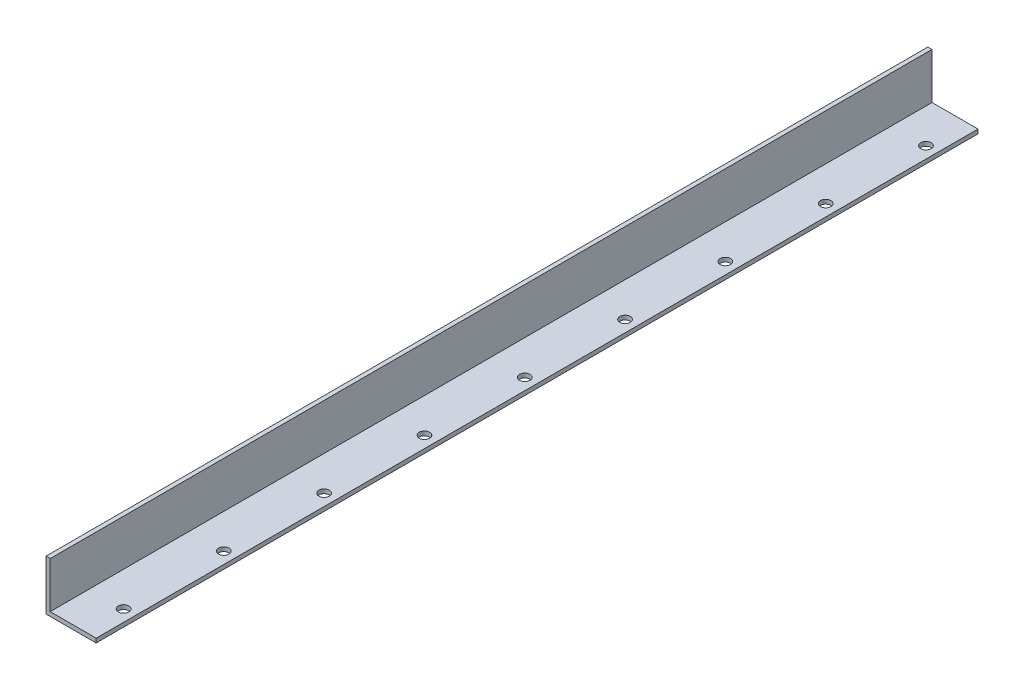
ISO-10303-21;
HEADER;
FILE_DESCRIPTION(('STEP AP214'),'2;1');
FILE_NAME('part.step','',(''),(''),'','','');
FILE_SCHEMA(('AUTOMOTIVE_DESIGN { 1 0 10303 214 1 1 1 1 }'));
ENDSEC;
DATA;
#1=APPLICATION_CONTEXT('core data for automotive mechanical design processes');
#2=APPLICATION_PROTOCOL_DEFINITION('international standard','automotive_design',2000,#1);
#3=PRODUCT_CONTEXT('',#1,'mechanical');
#4=PRODUCT('Part','Part','',(#3));
#5=PRODUCT_RELATED_PRODUCT_CATEGORY('part','',(#4));
#6=PRODUCT_DEFINITION_FORMATION('','',#4);
#7=PRODUCT_DEFINITION_CONTEXT('part definition',#1,'design');
#8=PRODUCT_DEFINITION('design','',#6,#7);
#9=PRODUCT_DEFINITION_SHAPE('','',#8);
#10=(LENGTH_UNIT() NAMED_UNIT(*) SI_UNIT(.MILLI.,.METRE.));
#11=(NAMED_UNIT(*) PLANE_ANGLE_UNIT() SI_UNIT($,.RADIAN.));
#12=(NAMED_UNIT(*) SI_UNIT($,.STERADIAN.) SOLID_ANGLE_UNIT());
#13=UNCERTAINTY_MEASURE_WITH_UNIT(LENGTH_MEASURE(1.E-05),#10,'distance_accuracy_value','');
#14=(GEOMETRIC_REPRESENTATION_CONTEXT(3) GLOBAL_UNCERTAINTY_ASSIGNED_CONTEXT((#13)) GLOBAL_UNIT_ASSIGNED_CONTEXT((#10,
#11,#12)) REPRESENTATION_CONTEXT('',''));
#15=CARTESIAN_POINT('',(0.,0.,0.));
#16=DIRECTION('',(0.,0.,1.));
#17=DIRECTION('',(1.,0.,0.));
#18=AXIS2_PLACEMENT_3D('',#15,#16,#17);
#19=CARTESIAN_POINT('',(29.291724556134,0.,-304.23716687116));
#20=DIRECTION('',(0.,-1.,0.));
#21=DIRECTION('',(0.,0.,-1.));
#22=AXIS2_PLACEMENT_3D('',#19,#20,#21);
#23=CYLINDRICAL_SURFACE('',#22,3.96875);
#24=CARTESIAN_POINT('',(29.291724556134,3.175,-304.23716687116));
#25=DIRECTION('',(0.,-1.,0.));
#26=DIRECTION('',(0.,0.,-1.));
#27=AXIS2_PLACEMENT_3D('',#24,#25,#26);
#28=CIRCLE('',#27,3.96875);
#29=CARTESIAN_POINT('',(29.291724556134,3.175,-308.20591687116));
#30=VERTEX_POINT('',#29);
#31=EDGE_CURVE('E19',#30,#30,#28,.T.);
#32=ORIENTED_EDGE('',*,*,#31,.F.);
#33=EDGE_LOOP('',(#32));
#34=FACE_BOUND('',#33,.T.);
#35=CARTESIAN_POINT('',(29.291724556134,0.,-304.23716687116));
#36=DIRECTION('',(0.,-1.,0.));
#37=DIRECTION('',(0.,0.,-1.));
#38=AXIS2_PLACEMENT_3D('',#35,#36,#37);
#39=CIRCLE('',#38,3.96875);
#40=CARTESIAN_POINT('',(29.291724556134,0.,-308.20591687116));
#41=VERTEX_POINT('',#40);
#42=EDGE_CURVE('E122',#41,#41,#39,.F.);
#43=ORIENTED_EDGE('',*,*,#42,.F.);
#44=EDGE_LOOP('',(#43));
#45=FACE_BOUND('',#44,.T.);
#46=ADVANCED_FACE('F16',(#34,#45),#23,.F.);
#47=CARTESIAN_POINT('',(29.291724556134,0.,-228.037166871033));
#48=DIRECTION('',(0.,-1.,0.));
#49=DIRECTION('',(0.,0.,-1.));
#50=AXIS2_PLACEMENT_3D('',#47,#48,#49);
#51=CYLINDRICAL_SURFACE('',#50,3.96875);
#52=CARTESIAN_POINT('',(29.291724556134,3.175,-228.037166871033));
#53=DIRECTION('',(0.,-1.,0.));
#54=DIRECTION('',(0.,0.,-1.));
#55=AXIS2_PLACEMENT_3D('',#52,#53,#54);
#56=CIRCLE('',#55,3.96875);
#57=CARTESIAN_POINT('',(29.291724556134,3.175,-232.005916871033));
#58=VERTEX_POINT('',#57);
#59=EDGE_CURVE('E144',#58,#58,#56,.T.);
#60=ORIENTED_EDGE('',*,*,#59,.F.);
#61=EDGE_LOOP('',(#60));
#62=FACE_BOUND('',#61,.T.);
#63=CARTESIAN_POINT('',(29.291724556134,0.,-228.037166871033));
#64=DIRECTION('',(0.,-1.,0.));
#65=DIRECTION('',(0.,0.,-1.));
#66=AXIS2_PLACEMENT_3D('',#63,#64,#65);
#67=CIRCLE('',#66,3.96875);
#68=CARTESIAN_POINT('',(29.291724556134,0.,-232.005916871033));
#69=VERTEX_POINT('',#68);
#70=EDGE_CURVE('E119',#69,#69,#67,.F.);
#71=ORIENTED_EDGE('',*,*,#70,.F.);
#72=EDGE_LOOP('',(#71));
#73=FACE_BOUND('',#72,.T.);
#74=ADVANCED_FACE('F154',(#62,#73),#51,.F.);
#75=CARTESIAN_POINT('',(29.291724556134,0.,-151.837166871033));
#76=DIRECTION('',(0.,-1.,0.));
#77=DIRECTION('',(0.,0.,-1.));
#78=AXIS2_PLACEMENT_3D('',#75,#76,#77);
#79=CYLINDRICAL_SURFACE('',#78,3.96875);
#80=CARTESIAN_POINT('',(29.291724556134,3.175,-151.837166871033));
#81=DIRECTION('',(0.,-1.,0.));
#82=DIRECTION('',(0.,0.,-1.));
#83=AXIS2_PLACEMENT_3D('',#80,#81,#82);
#84=CIRCLE('',#83,3.96875);
#85=CARTESIAN_POINT('',(29.291724556134,3.175,-155.805916871033));
#86=VERTEX_POINT('',#85);
#87=EDGE_CURVE('E142',#86,#86,#84,.T.);
#88=ORIENTED_EDGE('',*,*,#87,.F.);
#89=EDGE_LOOP('',(#88));
#90=FACE_BOUND('',#89,.T.);
#91=CARTESIAN_POINT('',(29.291724556134,0.,-151.837166871033));
#92=DIRECTION('',(0.,-1.,0.));
#93=DIRECTION('',(0.,0.,-1.));
#94=AXIS2_PLACEMENT_3D('',#91,#92,#93);
#95=CIRCLE('',#94,3.96875);
#96=CARTESIAN_POINT('',(29.291724556134,0.,-155.805916871033));
#97=VERTEX_POINT('',#96);
#98=EDGE_CURVE('E116',#97,#97,#95,.F.);
#99=ORIENTED_EDGE('',*,*,#98,.F.);
#100=EDGE_LOOP('',(#99));
#101=FACE_BOUND('',#100,.T.);
#102=ADVANCED_FACE('F315',(#90,#101),#79,.F.);
#103=CARTESIAN_POINT('',(29.291724556134,0.,-75.637166871033));
#104=DIRECTION('',(0.,-1.,0.));
#105=DIRECTION('',(0.,0.,-1.));
#106=AXIS2_PLACEMENT_3D('',#103,#104,#105);
#107=CYLINDRICAL_SURFACE('',#106,3.96875);
#108=CARTESIAN_POINT('',(29.291724556134,3.175,-75.637166871033));
#109=DIRECTION('',(0.,-1.,0.));
#110=DIRECTION('',(0.,0.,-1.));
#111=AXIS2_PLACEMENT_3D('',#108,#109,#110);
#112=CIRCLE('',#111,3.96875);
#113=CARTESIAN_POINT('',(29.291724556134,3.175,-79.605916871033));
#114=VERTEX_POINT('',#113);
#115=EDGE_CURVE('E139',#114,#114,#112,.T.);
#116=ORIENTED_EDGE('',*,*,#115,.F.);
#117=EDGE_LOOP('',(#116));
#118=FACE_BOUND('',#117,.T.);
#119=CARTESIAN_POINT('',(29.291724556134,0.,-75.637166871033));
#120=DIRECTION('',(0.,-1.,0.));
#121=DIRECTION('',(0.,0.,-1.));
#122=AXIS2_PLACEMENT_3D('',#119,#120,#121);
#123=CIRCLE('',#122,3.96875);
#124=CARTESIAN_POINT('',(29.291724556134,0.,-79.605916871033));
#125=VERTEX_POINT('',#124);
#126=EDGE_CURVE('E113',#125,#125,#123,.F.);
#127=ORIENTED_EDGE('',*,*,#126,.F.);
#128=EDGE_LOOP('',(#127));
#129=FACE_BOUND('',#128,.T.);
#130=ADVANCED_FACE('F306',(#118,#129),#107,.F.);
#131=CARTESIAN_POINT('',(29.291724556134,0.,0.562833128959634));
#132=DIRECTION('',(0.,-1.,0.));
#133=DIRECTION('',(0.,0.,-1.));
#134=AXIS2_PLACEMENT_3D('',#131,#132,#133);
#135=CYLINDRICAL_SURFACE('',#134,3.96875);
#136=CARTESIAN_POINT('',(29.291724556134,3.175,0.562833128959634));
#137=DIRECTION('',(0.,-1.,0.));
#138=DIRECTION('',(0.,0.,-1.));
#139=AXIS2_PLACEMENT_3D('',#136,#137,#138);
#140=CIRCLE('',#139,3.96875);
#141=CARTESIAN_POINT('',(29.291724556134,3.175,-3.40591687104037));
#142=VERTEX_POINT('',#141);
#143=EDGE_CURVE('E136',#142,#142,#140,.T.);
#144=ORIENTED_EDGE('',*,*,#143,.F.);
#145=EDGE_LOOP('',(#144));
#146=FACE_BOUND('',#145,.T.);
#147=CARTESIAN_POINT('',(29.291724556134,0.,0.562833128959634));
#148=DIRECTION('',(0.,-1.,0.));
#149=DIRECTION('',(0.,0.,-1.));
#150=AXIS2_PLACEMENT_3D('',#147,#148,#149);
#151=CIRCLE('',#150,3.96875);
#152=CARTESIAN_POINT('',(29.291724556134,0.,-3.40591687104037));
#153=VERTEX_POINT('',#152);
#154=EDGE_CURVE('E110',#153,#153,#151,.F.);
#155=ORIENTED_EDGE('',*,*,#154,.F.);
#156=EDGE_LOOP('',(#155));
#157=FACE_BOUND('',#156,.T.);
#158=ADVANCED_FACE('F297',(#146,#157),#135,.F.);
#159=CARTESIAN_POINT('',(29.291724556134,0.,76.762833128967));
#160=DIRECTION('',(0.,-1.,0.));
#161=DIRECTION('',(0.,0.,-1.));
#162=AXIS2_PLACEMENT_3D('',#159,#160,#161);
#163=CYLINDRICAL_SURFACE('',#162,3.96875);
#164=CARTESIAN_POINT('',(29.291724556134,3.175,76.762833128967));
#165=DIRECTION('',(0.,-1.,0.));
#166=DIRECTION('',(0.,0.,-1.));
#167=AXIS2_PLACEMENT_3D('',#164,#165,#166);
#168=CIRCLE('',#167,3.96875);
#169=CARTESIAN_POINT('',(29.291724556134,3.175,72.794083128967));
#170=VERTEX_POINT('',#169);
#171=EDGE_CURVE('E133',#170,#170,#168,.T.);
#172=ORIENTED_EDGE('',*,*,#171,.F.);
#173=EDGE_LOOP('',(#172));
#174=FACE_BOUND('',#173,.T.);
#175=CARTESIAN_POINT('',(29.291724556134,0.,76.762833128967));
#176=DIRECTION('',(0.,-1.,0.));
#177=DIRECTION('',(0.,0.,-1.));
#178=AXIS2_PLACEMENT_3D('',#175,#176,#177);
#179=CIRCLE('',#178,3.96875);
#180=CARTESIAN_POINT('',(29.291724556134,0.,72.794083128967));
#181=VERTEX_POINT('',#180);
#182=EDGE_CURVE('E107',#181,#181,#179,.F.);
#183=ORIENTED_EDGE('',*,*,#182,.F.);
#184=EDGE_LOOP('',(#183));
#185=FACE_BOUND('',#184,.T.);
#186=ADVANCED_FACE('F288',(#174,#185),#163,.F.);
#187=CARTESIAN_POINT('',(29.291724556134,0.,152.962833128967));
#188=DIRECTION('',(0.,-1.,0.));
#189=DIRECTION('',(0.,0.,-1.));
#190=AXIS2_PLACEMENT_3D('',#187,#188,#189);
#191=CYLINDRICAL_SURFACE('',#190,3.96875);
#192=CARTESIAN_POINT('',(29.291724556134,3.175,152.962833128967));
#193=DIRECTION('',(0.,-1.,0.));
#194=DIRECTION('',(0.,0.,-1.));
#195=AXIS2_PLACEMENT_3D('',#192,#193,#194);
#196=CIRCLE('',#195,3.96875);
#197=CARTESIAN_POINT('',(29.291724556134,3.175,148.994083128967));
#198=VERTEX_POINT('',#197);
#199=EDGE_CURVE('E130',#198,#198,#196,.T.);
#200=ORIENTED_EDGE('',*,*,#199,.F.);
#201=EDGE_LOOP('',(#200));
#202=FACE_BOUND('',#201,.T.);
#203=CARTESIAN_POINT('',(29.291724556134,0.,152.962833128967));
#204=DIRECTION('',(0.,-1.,0.));
#205=DIRECTION('',(0.,0.,-1.));
#206=AXIS2_PLACEMENT_3D('',#203,#204,#205);
#207=CIRCLE('',#206,3.96875);
#208=CARTESIAN_POINT('',(29.291724556134,0.,148.994083128967));
#209=VERTEX_POINT('',#208);
#210=EDGE_CURVE('E104',#209,#209,#207,.F.);
#211=ORIENTED_EDGE('',*,*,#210,.F.);
#212=EDGE_LOOP('',(#211));
#213=FACE_BOUND('',#212,.T.);
#214=ADVANCED_FACE('F279',(#202,#213),#191,.F.);
#215=CARTESIAN_POINT('',(29.291724556134,0.,229.162833128967));
#216=DIRECTION('',(0.,-1.,0.));
#217=DIRECTION('',(0.,0.,-1.));
#218=AXIS2_PLACEMENT_3D('',#215,#216,#217);
#219=CYLINDRICAL_SURFACE('',#218,3.96875);
#220=CARTESIAN_POINT('',(29.291724556134,3.175,229.162833128967));
#221=DIRECTION('',(0.,-1.,0.));
#222=DIRECTION('',(0.,0.,-1.));
#223=AXIS2_PLACEMENT_3D('',#220,#221,#222);
#224=CIRCLE('',#223,3.96875);
#225=CARTESIAN_POINT('',(29.291724556134,3.175,225.194083128967));
#226=VERTEX_POINT('',#225);
#227=EDGE_CURVE('E127',#226,#226,#224,.T.);
#228=ORIENTED_EDGE('',*,*,#227,.F.);
#229=EDGE_LOOP('',(#228));
#230=FACE_BOUND('',#229,.T.);
#231=CARTESIAN_POINT('',(29.291724556134,0.,229.162833128967));
#232=DIRECTION('',(0.,-1.,0.));
#233=DIRECTION('',(0.,0.,-1.));
#234=AXIS2_PLACEMENT_3D('',#231,#232,#233);
#235=CIRCLE('',#234,3.96875);
#236=CARTESIAN_POINT('',(29.291724556134,0.,225.194083128967));
#237=VERTEX_POINT('',#236);
#238=EDGE_CURVE('E101',#237,#237,#235,.F.);
#239=ORIENTED_EDGE('',*,*,#238,.F.);
#240=EDGE_LOOP('',(#239));
#241=FACE_BOUND('',#240,.T.);
#242=ADVANCED_FACE('F270',(#230,#241),#219,.F.);
#243=CARTESIAN_POINT('',(29.291724556134,0.,305.36283312884));
#244=DIRECTION('',(0.,-1.,0.));
#245=DIRECTION('',(0.,0.,-1.));
#246=AXIS2_PLACEMENT_3D('',#243,#244,#245);
#247=CYLINDRICAL_SURFACE('',#246,3.96875);
#248=CARTESIAN_POINT('',(29.291724556134,3.175,305.36283312884));
#249=DIRECTION('',(0.,-1.,0.));
#250=DIRECTION('',(0.,0.,-1.));
#251=AXIS2_PLACEMENT_3D('',#248,#249,#250);
#252=CIRCLE('',#251,3.96875);
#253=CARTESIAN_POINT('',(29.291724556134,3.175,301.39408312884));
#254=VERTEX_POINT('',#253);
#255=EDGE_CURVE('E95',#254,#254,#252,.T.);
#256=ORIENTED_EDGE('',*,*,#255,.F.);
#257=EDGE_LOOP('',(#256));
#258=FACE_BOUND('',#257,.T.);
#259=CARTESIAN_POINT('',(29.291724556134,0.,305.36283312884));
#260=DIRECTION('',(0.,-1.,0.));
#261=DIRECTION('',(0.,0.,-1.));
#262=AXIS2_PLACEMENT_3D('',#259,#260,#261);
#263=CIRCLE('',#262,3.96875);
#264=CARTESIAN_POINT('',(29.291724556134,0.,301.39408312884));
#265=VERTEX_POINT('',#264);
#266=EDGE_CURVE('E97',#265,#265,#263,.F.);
#267=ORIENTED_EDGE('',*,*,#266,.F.);
#268=EDGE_LOOP('',(#267));
#269=FACE_BOUND('',#268,.T.);
#270=ADVANCED_FACE('F262',(#258,#269),#247,.F.);
#271=CARTESIAN_POINT('',(38.1,0.,-334.9625));
#272=DIRECTION('',(1.,0.,0.));
#273=DIRECTION('',(0.,0.,-1.));
#274=AXIS2_PLACEMENT_3D('',#271,#272,#273);
#275=PLANE('',#274);
#276=DIRECTION('',(0.,1.,0.));
#277=VECTOR('',#276,1.);
#278=CARTESIAN_POINT('',(38.1,0.,334.9625));
#279=LINE('',#278,#277);
#280=CARTESIAN_POINT('',(38.1,0.,334.9625));
#281=VERTEX_POINT('',#280);
#282=CARTESIAN_POINT('',(38.1,3.175,334.9625));
#283=VERTEX_POINT('',#282);
#284=EDGE_CURVE('E168',#281,#283,#279,.T.);
#285=ORIENTED_EDGE('',*,*,#284,.F.);
#286=DIRECTION('',(0.,0.,-1.));
#287=VECTOR('',#286,1.);
#288=CARTESIAN_POINT('',(38.1,0.,-334.9625));
#289=LINE('',#288,#287);
#290=CARTESIAN_POINT('',(38.1,0.,-334.9625));
#291=VERTEX_POINT('',#290);
#292=EDGE_CURVE('E76',#291,#281,#289,.F.);
#293=ORIENTED_EDGE('',*,*,#292,.F.);
#294=DIRECTION('',(0.,1.,0.));
#295=VECTOR('',#294,1.);
#296=CARTESIAN_POINT('',(38.1,0.,-334.9625));
#297=LINE('',#296,#295);
#298=CARTESIAN_POINT('',(38.1,3.175,-334.9625));
#299=VERTEX_POINT('',#298);
#300=EDGE_CURVE('E71',#291,#299,#297,.T.);
#301=ORIENTED_EDGE('',*,*,#300,.T.);
#302=DIRECTION('',(0.,0.,1.));
#303=VECTOR('',#302,1.);
#304=CARTESIAN_POINT('',(38.1,3.175,-334.9625));
#305=LINE('',#304,#303);
#306=EDGE_CURVE('E74',#283,#299,#305,.F.);
#307=ORIENTED_EDGE('',*,*,#306,.F.);
#308=EDGE_LOOP('',(#285,#293,#301,#307));
#309=FACE_BOUND('',#308,.T.);
#310=ADVANCED_FACE('F73',(#309),#275,.T.);
#311=CARTESIAN_POINT('',(38.1,3.175,-334.9625));
#312=DIRECTION('',(0.,1.,0.));
#313=DIRECTION('',(0.,0.,1.));
#314=AXIS2_PLACEMENT_3D('',#311,#312,#313);
#315=PLANE('',#314);
#316=ORIENTED_EDGE('',*,*,#255,.T.);
#317=EDGE_LOOP('',(#316));
#318=FACE_BOUND('',#317,.T.);
#319=ORIENTED_EDGE('',*,*,#227,.T.);
#320=EDGE_LOOP('',(#319));
#321=FACE_BOUND('',#320,.T.);
#322=ORIENTED_EDGE('',*,*,#199,.T.);
#323=EDGE_LOOP('',(#322));
#324=FACE_BOUND('',#323,.T.);
#325=ORIENTED_EDGE('',*,*,#171,.T.);
#326=EDGE_LOOP('',(#325));
#327=FACE_BOUND('',#326,.T.);
#328=ORIENTED_EDGE('',*,*,#143,.T.);
#329=EDGE_LOOP('',(#328));
#330=FACE_BOUND('',#329,.T.);
#331=ORIENTED_EDGE('',*,*,#115,.T.);
#332=EDGE_LOOP('',(#331));
#333=FACE_BOUND('',#332,.T.);
#334=ORIENTED_EDGE('',*,*,#87,.T.);
#335=EDGE_LOOP('',(#334));
#336=FACE_BOUND('',#335,.T.);
#337=ORIENTED_EDGE('',*,*,#59,.T.);
#338=EDGE_LOOP('',(#337));
#339=FACE_BOUND('',#338,.T.);
#340=ORIENTED_EDGE('',*,*,#31,.T.);
#341=EDGE_LOOP('',(#340));
#342=FACE_BOUND('',#341,.T.);
#343=DIRECTION('',(1.,0.,0.));
#344=VECTOR('',#343,1.);
#345=CARTESIAN_POINT('',(0.,3.175,334.9625));
#346=LINE('',#345,#344);
#347=CARTESIAN_POINT('',(3.175,3.175,334.9625));
#348=VERTEX_POINT('',#347);
#349=EDGE_CURVE('E83',#283,#348,#346,.F.);
#350=ORIENTED_EDGE('',*,*,#349,.F.);
#351=ORIENTED_EDGE('',*,*,#306,.T.);
#352=DIRECTION('',(1.,0.,0.));
#353=VECTOR('',#352,1.);
#354=CARTESIAN_POINT('',(0.,3.175,-334.9625));
#355=LINE('',#354,#353);
#356=CARTESIAN_POINT('',(3.175,3.175,-334.9625));
#357=VERTEX_POINT('',#356);
#358=EDGE_CURVE('E66',#299,#357,#355,.F.);
#359=ORIENTED_EDGE('',*,*,#358,.T.);
#360=DIRECTION('',(0.,0.,-1.));
#361=VECTOR('',#360,1.);
#362=CARTESIAN_POINT('',(3.175,3.175,-334.9625));
#363=LINE('',#362,#361);
#364=EDGE_CURVE('E79',#348,#357,#363,.T.);
#365=ORIENTED_EDGE('',*,*,#364,.F.);
#366=EDGE_LOOP('',(#350,#351,#359,#365));
#367=FACE_BOUND('',#366,.T.);
#368=ADVANCED_FACE('F81',(#318,#321,#324,#327,#330,#333,#336,#339,#342,#367),#315,.T.);
#369=CARTESIAN_POINT('',(3.175,3.175,-334.9625));
#370=DIRECTION('',(1.,0.,0.));
#371=DIRECTION('',(0.,0.,-1.));
#372=AXIS2_PLACEMENT_3D('',#369,#370,#371);
#373=PLANE('',#372);
#374=DIRECTION('',(0.,1.,0.));
#375=VECTOR('',#374,1.);
#376=CARTESIAN_POINT('',(3.175,0.,334.9625));
#377=LINE('',#376,#375);
#378=CARTESIAN_POINT('',(3.175,38.1,334.9625));
#379=VERTEX_POINT('',#378);
#380=EDGE_CURVE('E185',#348,#379,#377,.T.);
#381=ORIENTED_EDGE('',*,*,#380,.F.);
#382=ORIENTED_EDGE('',*,*,#364,.T.);
#383=DIRECTION('',(0.,1.,0.));
#384=VECTOR('',#383,1.);
#385=CARTESIAN_POINT('',(3.175,0.,-334.9625));
#386=LINE('',#385,#384);
#387=CARTESIAN_POINT('',(3.175,38.1,-334.9625));
#388=VERTEX_POINT('',#387);
#389=EDGE_CURVE('E89',#357,#388,#386,.T.);
#390=ORIENTED_EDGE('',*,*,#389,.T.);
#391=DIRECTION('',(0.,0.,1.));
#392=VECTOR('',#391,1.);
#393=CARTESIAN_POINT('',(3.175,38.1,-334.9625));
#394=LINE('',#393,#392);
#395=EDGE_CURVE('E176',#379,#388,#394,.F.);
#396=ORIENTED_EDGE('',*,*,#395,.F.);
#397=EDGE_LOOP('',(#381,#382,#390,#396));
#398=FACE_BOUND('',#397,.T.);
#399=ADVANCED_FACE('F194',(#398),#373,.T.);
#400=CARTESIAN_POINT('',(0.,0.,-334.9625));
#401=DIRECTION('',(0.,0.,1.));
#402=DIRECTION('',(1.,0.,0.));
#403=AXIS2_PLACEMENT_3D('',#400,#401,#402);
#404=PLANE('',#403);
#405=DIRECTION('',(0.,1.,0.));
#406=VECTOR('',#405,1.);
#407=CARTESIAN_POINT('',(0.,38.1,-334.9625));
#408=LINE('',#407,#406);
#409=CARTESIAN_POINT('',(0.,38.1,-334.9625));
#410=VERTEX_POINT('',#409);
#411=CARTESIAN_POINT('',(0.,0.,-334.9625));
#412=VERTEX_POINT('',#411);
#413=EDGE_CURVE('E174',#410,#412,#408,.F.);
#414=ORIENTED_EDGE('',*,*,#413,.F.);
#415=DIRECTION('',(1.,0.,0.));
#416=VECTOR('',#415,1.);
#417=CARTESIAN_POINT('',(3.175,38.1,-334.9625));
#418=LINE('',#417,#416);
#419=EDGE_CURVE('E182',#388,#410,#418,.F.);
#420=ORIENTED_EDGE('',*,*,#419,.F.);
#421=ORIENTED_EDGE('',*,*,#389,.F.);
#422=ORIENTED_EDGE('',*,*,#358,.F.);
#423=ORIENTED_EDGE('',*,*,#300,.F.);
#424=DIRECTION('',(1.,0.,0.));
#425=VECTOR('',#424,1.);
#426=CARTESIAN_POINT('',(0.,0.,-334.9625));
#427=LINE('',#426,#425);
#428=EDGE_CURVE('E91',#412,#291,#427,.T.);
#429=ORIENTED_EDGE('',*,*,#428,.F.);
#430=EDGE_LOOP('',(#414,#420,#421,#422,#423,#429));
#431=FACE_BOUND('',#430,.T.);
#432=ADVANCED_FACE('F87',(#431),#404,.F.);
#433=CARTESIAN_POINT('',(0.,0.,-334.9625));
#434=DIRECTION('',(0.,-1.,0.));
#435=DIRECTION('',(0.,0.,-1.));
#436=AXIS2_PLACEMENT_3D('',#433,#434,#435);
#437=PLANE('',#436);
#438=ORIENTED_EDGE('',*,*,#266,.T.);
#439=EDGE_LOOP('',(#438));
#440=FACE_BOUND('',#439,.T.);
#441=ORIENTED_EDGE('',*,*,#238,.T.);
#442=EDGE_LOOP('',(#441));
#443=FACE_BOUND('',#442,.T.);
#444=ORIENTED_EDGE('',*,*,#210,.T.);
#445=EDGE_LOOP('',(#444));
#446=FACE_BOUND('',#445,.T.);
#447=ORIENTED_EDGE('',*,*,#182,.T.);
#448=EDGE_LOOP('',(#447));
#449=FACE_BOUND('',#448,.T.);
#450=ORIENTED_EDGE('',*,*,#154,.T.);
#451=EDGE_LOOP('',(#450));
#452=FACE_BOUND('',#451,.T.);
#453=ORIENTED_EDGE('',*,*,#126,.T.);
#454=EDGE_LOOP('',(#453));
#455=FACE_BOUND('',#454,.T.);
#456=ORIENTED_EDGE('',*,*,#98,.T.);
#457=EDGE_LOOP('',(#456));
#458=FACE_BOUND('',#457,.T.);
#459=ORIENTED_EDGE('',*,*,#70,.T.);
#460=EDGE_LOOP('',(#459));
#461=FACE_BOUND('',#460,.T.);
#462=ORIENTED_EDGE('',*,*,#42,.T.);
#463=EDGE_LOOP('',(#462));
#464=FACE_BOUND('',#463,.T.);
#465=DIRECTION('',(1.,0.,0.));
#466=VECTOR('',#465,1.);
#467=CARTESIAN_POINT('',(0.,0.,334.9625));
#468=LINE('',#467,#466);
#469=CARTESIAN_POINT('',(0.,0.,334.9625));
#470=VERTEX_POINT('',#469);
#471=EDGE_CURVE('E100',#470,#281,#468,.T.);
#472=ORIENTED_EDGE('',*,*,#471,.F.);
#473=DIRECTION('',(0.,0.,1.));
#474=VECTOR('',#473,1.);
#475=CARTESIAN_POINT('',(0.,0.,-334.9625));
#476=LINE('',#475,#474);
#477=EDGE_CURVE('E166',#412,#470,#476,.T.);
#478=ORIENTED_EDGE('',*,*,#477,.F.);
#479=ORIENTED_EDGE('',*,*,#428,.T.);
#480=ORIENTED_EDGE('',*,*,#292,.T.);
#481=EDGE_LOOP('',(#472,#478,#479,#480));
#482=FACE_BOUND('',#481,.T.);
#483=ADVANCED_FACE('F157',(#440,#443,#446,#449,#452,#455,#458,#461,#464,#482),#437,.T.);
#484=CARTESIAN_POINT('',(0.,0.,334.9625));
#485=DIRECTION('',(0.,0.,1.));
#486=DIRECTION('',(1.,0.,0.));
#487=AXIS2_PLACEMENT_3D('',#484,#485,#486);
#488=PLANE('',#487);
#489=DIRECTION('',(1.,0.,0.));
#490=VECTOR('',#489,1.);
#491=CARTESIAN_POINT('',(3.175,38.1,334.9625));
#492=LINE('',#491,#490);
#493=CARTESIAN_POINT('',(0.,38.1,334.9625));
#494=VERTEX_POINT('',#493);
#495=EDGE_CURVE('E34',#494,#379,#492,.T.);
#496=ORIENTED_EDGE('',*,*,#495,.F.);
#497=DIRECTION('',(0.,1.,0.));
#498=VECTOR('',#497,1.);
#499=CARTESIAN_POINT('',(0.,38.1,334.9625));
#500=LINE('',#499,#498);
#501=EDGE_CURVE('E25',#470,#494,#500,.T.);
#502=ORIENTED_EDGE('',*,*,#501,.F.);
#503=ORIENTED_EDGE('',*,*,#471,.T.);
#504=ORIENTED_EDGE('',*,*,#284,.T.);
#505=ORIENTED_EDGE('',*,*,#349,.T.);
#506=ORIENTED_EDGE('',*,*,#380,.T.);
#507=EDGE_LOOP('',(#496,#502,#503,#504,#505,#506));
#508=FACE_BOUND('',#507,.T.);
#509=ADVANCED_FACE('F160',(#508),#488,.T.);
#510=CARTESIAN_POINT('',(3.175,38.1,-334.9625));
#511=DIRECTION('',(0.,1.,0.));
#512=DIRECTION('',(0.,0.,1.));
#513=AXIS2_PLACEMENT_3D('',#510,#511,#512);
#514=PLANE('',#513);
#515=ORIENTED_EDGE('',*,*,#495,.T.);
#516=ORIENTED_EDGE('',*,*,#395,.T.);
#517=ORIENTED_EDGE('',*,*,#419,.T.);
#518=DIRECTION('',(0.,0.,1.));
#519=VECTOR('',#518,1.);
#520=CARTESIAN_POINT('',(0.,38.1,-334.9625));
#521=LINE('',#520,#519);
#522=EDGE_CURVE('E11',#494,#410,#521,.F.);
#523=ORIENTED_EDGE('',*,*,#522,.F.);
#524=EDGE_LOOP('',(#515,#516,#517,#523));
#525=FACE_BOUND('',#524,.T.);
#526=ADVANCED_FACE('F190',(#525),#514,.T.);
#527=CARTESIAN_POINT('',(0.,38.1,-334.9625));
#528=DIRECTION('',(-1.,0.,0.));
#529=DIRECTION('',(0.,0.,1.));
#530=AXIS2_PLACEMENT_3D('',#527,#528,#529);
#531=PLANE('',#530);
#532=ORIENTED_EDGE('',*,*,#501,.T.);
#533=ORIENTED_EDGE('',*,*,#522,.T.);
#534=ORIENTED_EDGE('',*,*,#413,.T.);
#535=ORIENTED_EDGE('',*,*,#477,.T.);
#536=EDGE_LOOP('',(#532,#533,#534,#535));
#537=FACE_BOUND('',#536,.T.);
#538=ADVANCED_FACE('F173',(#537),#531,.T.);
#539=CLOSED_SHELL('',(#46,#74,#102,#130,#158,#186,#214,#242,#270,#310,#368,#399,#432,#483,#509,
#526,#538));
#540=MANIFOLD_SOLID_BREP('B1',#539);
#541=ADVANCED_BREP_SHAPE_REPRESENTATION('',(#18,#540),#14);
#542=SHAPE_DEFINITION_REPRESENTATION(#9,#541);
ENDSEC;
END-ISO-10303-21;
